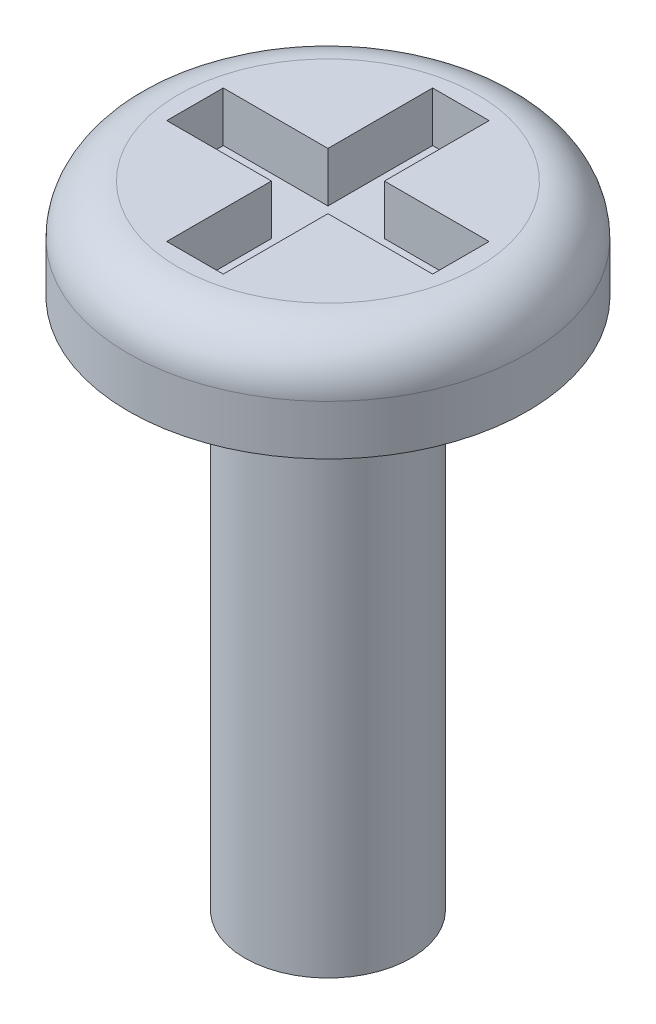
ISO-10303-21;
HEADER;
FILE_DESCRIPTION(('STEP AP214'),'2;1');
FILE_NAME('part.step','',(''),(''),'','','');
FILE_SCHEMA(('AUTOMOTIVE_DESIGN { 1 0 10303 214 1 1 1 1 }'));
ENDSEC;
DATA;
#1=APPLICATION_CONTEXT('core data for automotive mechanical design processes');
#2=APPLICATION_PROTOCOL_DEFINITION('international standard','automotive_design',2000,#1);
#3=PRODUCT_CONTEXT('',#1,'mechanical');
#4=PRODUCT('Part','Part','',(#3));
#5=PRODUCT_RELATED_PRODUCT_CATEGORY('part','',(#4));
#6=PRODUCT_DEFINITION_FORMATION('','',#4);
#7=PRODUCT_DEFINITION_CONTEXT('part definition',#1,'design');
#8=PRODUCT_DEFINITION('design','',#6,#7);
#9=PRODUCT_DEFINITION_SHAPE('','',#8);
#10=(LENGTH_UNIT() NAMED_UNIT(*) SI_UNIT(.MILLI.,.METRE.));
#11=(NAMED_UNIT(*) PLANE_ANGLE_UNIT() SI_UNIT($,.RADIAN.));
#12=(NAMED_UNIT(*) SI_UNIT($,.STERADIAN.) SOLID_ANGLE_UNIT());
#13=UNCERTAINTY_MEASURE_WITH_UNIT(LENGTH_MEASURE(1.E-05),#10,'distance_accuracy_value','');
#14=(GEOMETRIC_REPRESENTATION_CONTEXT(3) GLOBAL_UNCERTAINTY_ASSIGNED_CONTEXT((#13)) GLOBAL_UNIT_ASSIGNED_CONTEXT((#10,
#11,#12)) REPRESENTATION_CONTEXT('',''));
#15=CARTESIAN_POINT('',(0.,0.,0.));
#16=DIRECTION('',(0.,0.,1.));
#17=DIRECTION('',(1.,0.,0.));
#18=AXIS2_PLACEMENT_3D('',#15,#16,#17);
#19=CARTESIAN_POINT('',(0.,8.,0.));
#20=DIRECTION('',(0.,-1.,0.));
#21=DIRECTION('',(0.,0.,-1.));
#22=AXIS2_PLACEMENT_3D('',#19,#20,#21);
#23=CYLINDRICAL_SURFACE('',#22,1.25);
#24=CARTESIAN_POINT('',(0.,0.,0.));
#25=DIRECTION('',(0.,1.,0.));
#26=DIRECTION('',(0.,0.,1.));
#27=AXIS2_PLACEMENT_3D('',#24,#25,#26);
#28=CIRCLE('',#27,1.25);
#29=CARTESIAN_POINT('',(0.,0.,1.25));
#30=VERTEX_POINT('',#29);
#31=EDGE_CURVE('E213',#30,#30,#28,.T.);
#32=ORIENTED_EDGE('',*,*,#31,.T.);
#33=EDGE_LOOP('',(#32));
#34=FACE_BOUND('',#33,.T.);
#35=CARTESIAN_POINT('',(0.,7.,0.));
#36=DIRECTION('',(0.,1.,0.));
#37=DIRECTION('',(0.,0.,1.));
#38=AXIS2_PLACEMENT_3D('',#35,#36,#37);
#39=CIRCLE('',#38,1.25);
#40=CARTESIAN_POINT('',(0.,7.,1.25));
#41=VERTEX_POINT('',#40);
#42=EDGE_CURVE('E11',#41,#41,#39,.T.);
#43=ORIENTED_EDGE('',*,*,#42,.F.);
#44=EDGE_LOOP('',(#43));
#45=FACE_BOUND('',#44,.T.);
#46=ADVANCED_FACE('F36',(#34,#45),#23,.T.);
#47=ORIENTED_EDGE('',*,*,#42,.T.);
#48=EDGE_LOOP('',(#47));
#49=FACE_BOUND('',#48,.T.);
#50=CARTESIAN_POINT('',(0.,8.,0.));
#51=DIRECTION('',(0.,1.,0.));
#52=DIRECTION('',(0.,0.,1.));
#53=AXIS2_PLACEMENT_3D('',#50,#51,#52);
#54=CIRCLE('',#53,1.25);
#55=CARTESIAN_POINT('',(0.,8.,1.25));
#56=VERTEX_POINT('',#55);
#57=EDGE_CURVE('E214',#56,#56,#54,.T.);
#58=ORIENTED_EDGE('',*,*,#57,.F.);
#59=EDGE_LOOP('',(#58));
#60=FACE_BOUND('',#59,.T.);
#61=ADVANCED_FACE('F247',(#49,#60),#23,.T.);
#62=CARTESIAN_POINT('',(0.,0.,0.));
#63=DIRECTION('',(0.,1.,0.));
#64=DIRECTION('',(0.,0.,1.));
#65=AXIS2_PLACEMENT_3D('',#62,#63,#64);
#66=PLANE('',#65);
#67=ORIENTED_EDGE('',*,*,#31,.F.);
#68=EDGE_LOOP('',(#67));
#69=FACE_BOUND('',#68,.T.);
#70=ADVANCED_FACE('F243',(#69),#66,.F.);
#71=CARTESIAN_POINT('',(0.,9.5,0.));
#72=DIRECTION('',(0.,-1.,0.));
#73=DIRECTION('',(0.,0.,-1.));
#74=AXIS2_PLACEMENT_3D('',#71,#72,#73);
#75=CYLINDRICAL_SURFACE('',#74,3.);
#76=CARTESIAN_POINT('',(0.,8.75,0.));
#77=DIRECTION('',(0.,1.,0.));
#78=DIRECTION('',(0.,0.,1.));
#79=AXIS2_PLACEMENT_3D('',#76,#77,#78);
#80=CIRCLE('',#79,3.);
#81=CARTESIAN_POINT('',(0.,8.75,3.));
#82=VERTEX_POINT('',#81);
#83=EDGE_CURVE('E45',#82,#82,#80,.F.);
#84=ORIENTED_EDGE('',*,*,#83,.T.);
#85=EDGE_LOOP('',(#84));
#86=FACE_BOUND('',#85,.T.);
#87=CARTESIAN_POINT('',(0.,8.,0.));
#88=DIRECTION('',(0.,1.,0.));
#89=DIRECTION('',(0.,0.,1.));
#90=AXIS2_PLACEMENT_3D('',#87,#88,#89);
#91=CIRCLE('',#90,3.);
#92=CARTESIAN_POINT('',(0.,8.,3.));
#93=VERTEX_POINT('',#92);
#94=EDGE_CURVE('E193',#93,#93,#91,.T.);
#95=ORIENTED_EDGE('',*,*,#94,.T.);
#96=EDGE_LOOP('',(#95));
#97=FACE_BOUND('',#96,.T.);
#98=ADVANCED_FACE('F224',(#86,#97),#75,.T.);
#99=CARTESIAN_POINT('',(0.,9.5,0.));
#100=DIRECTION('',(0.,1.,0.));
#101=DIRECTION('',(0.,0.,1.));
#102=AXIS2_PLACEMENT_3D('',#99,#100,#101);
#103=PLANE('',#102);
#104=DIRECTION('',(1.,0.,0.));
#105=VECTOR('',#104,1.);
#106=CARTESIAN_POINT('',(0.425,9.5,0.425));
#107=LINE('',#106,#105);
#108=CARTESIAN_POINT('',(0.425,9.5,0.425));
#109=VERTEX_POINT('',#108);
#110=CARTESIAN_POINT('',(2.,9.5,0.425));
#111=VERTEX_POINT('',#110);
#112=EDGE_CURVE('E52',#109,#111,#107,.T.);
#113=ORIENTED_EDGE('',*,*,#112,.F.);
#114=DIRECTION('',(0.,0.,-1.));
#115=VECTOR('',#114,1.);
#116=CARTESIAN_POINT('',(0.425,9.5,0.425));
#117=LINE('',#116,#115);
#118=CARTESIAN_POINT('',(0.425,9.5,2.));
#119=VERTEX_POINT('',#118);
#120=EDGE_CURVE('E189',#119,#109,#117,.T.);
#121=ORIENTED_EDGE('',*,*,#120,.F.);
#122=DIRECTION('',(1.,0.,0.));
#123=VECTOR('',#122,1.);
#124=CARTESIAN_POINT('',(-0.425,9.5,2.));
#125=LINE('',#124,#123);
#126=CARTESIAN_POINT('',(-0.425,9.5,2.));
#127=VERTEX_POINT('',#126);
#128=EDGE_CURVE('E187',#127,#119,#125,.T.);
#129=ORIENTED_EDGE('',*,*,#128,.F.);
#130=DIRECTION('',(0.,0.,1.));
#131=VECTOR('',#130,1.);
#132=CARTESIAN_POINT('',(-0.425,9.5,0.425));
#133=LINE('',#132,#131);
#134=CARTESIAN_POINT('',(-0.425,9.5,0.425));
#135=VERTEX_POINT('',#134);
#136=EDGE_CURVE('E136',#135,#127,#133,.T.);
#137=ORIENTED_EDGE('',*,*,#136,.F.);
#138=DIRECTION('',(1.,0.,0.));
#139=VECTOR('',#138,1.);
#140=CARTESIAN_POINT('',(-2.,9.5,0.425));
#141=LINE('',#140,#139);
#142=CARTESIAN_POINT('',(-2.,9.5,0.425));
#143=VERTEX_POINT('',#142);
#144=EDGE_CURVE('E183',#143,#135,#141,.T.);
#145=ORIENTED_EDGE('',*,*,#144,.F.);
#146=DIRECTION('',(0.,0.,1.));
#147=VECTOR('',#146,1.);
#148=CARTESIAN_POINT('',(-2.,9.5,-0.425));
#149=LINE('',#148,#147);
#150=CARTESIAN_POINT('',(-2.,9.5,-0.425));
#151=VERTEX_POINT('',#150);
#152=EDGE_CURVE('E180',#151,#143,#149,.T.);
#153=ORIENTED_EDGE('',*,*,#152,.F.);
#154=DIRECTION('',(-1.,0.,0.));
#155=VECTOR('',#154,1.);
#156=CARTESIAN_POINT('',(-2.,9.5,-0.425));
#157=LINE('',#156,#155);
#158=CARTESIAN_POINT('',(-0.425,9.5,-0.425));
#159=VERTEX_POINT('',#158);
#160=EDGE_CURVE('E177',#159,#151,#157,.T.);
#161=ORIENTED_EDGE('',*,*,#160,.F.);
#162=DIRECTION('',(0.,0.,1.));
#163=VECTOR('',#162,1.);
#164=CARTESIAN_POINT('',(-0.425,9.5,-2.));
#165=LINE('',#164,#163);
#166=CARTESIAN_POINT('',(-0.425,9.5,-2.));
#167=VERTEX_POINT('',#166);
#168=EDGE_CURVE('E174',#167,#159,#165,.T.);
#169=ORIENTED_EDGE('',*,*,#168,.F.);
#170=DIRECTION('',(-1.,0.,0.));
#171=VECTOR('',#170,1.);
#172=CARTESIAN_POINT('',(-0.425,9.5,-2.));
#173=LINE('',#172,#171);
#174=CARTESIAN_POINT('',(0.425,9.5,-2.));
#175=VERTEX_POINT('',#174);
#176=EDGE_CURVE('E171',#175,#167,#173,.T.);
#177=ORIENTED_EDGE('',*,*,#176,.F.);
#178=DIRECTION('',(0.,0.,-1.));
#179=VECTOR('',#178,1.);
#180=CARTESIAN_POINT('',(0.425,9.5,-2.));
#181=LINE('',#180,#179);
#182=CARTESIAN_POINT('',(0.425,9.5,-0.425));
#183=VERTEX_POINT('',#182);
#184=EDGE_CURVE('E168',#183,#175,#181,.T.);
#185=ORIENTED_EDGE('',*,*,#184,.F.);
#186=DIRECTION('',(-1.,0.,0.));
#187=VECTOR('',#186,1.);
#188=CARTESIAN_POINT('',(0.425,9.5,-0.425));
#189=LINE('',#188,#187);
#190=CARTESIAN_POINT('',(2.,9.5,-0.425));
#191=VERTEX_POINT('',#190);
#192=EDGE_CURVE('E165',#191,#183,#189,.T.);
#193=ORIENTED_EDGE('',*,*,#192,.F.);
#194=DIRECTION('',(0.,0.,-1.));
#195=VECTOR('',#194,1.);
#196=CARTESIAN_POINT('',(2.,9.5,-0.425));
#197=LINE('',#196,#195);
#198=EDGE_CURVE('E162',#111,#191,#197,.T.);
#199=ORIENTED_EDGE('',*,*,#198,.F.);
#200=EDGE_LOOP('',(#113,#121,#129,#137,#145,#153,#161,#169,#177,#185,#193,#199));
#201=FACE_BOUND('',#200,.T.);
#202=CARTESIAN_POINT('',(0.,9.5,0.));
#203=DIRECTION('',(0.,1.,0.));
#204=DIRECTION('',(0.,0.,1.));
#205=AXIS2_PLACEMENT_3D('',#202,#203,#204);
#206=CIRCLE('',#205,2.25);
#207=CARTESIAN_POINT('',(0.,9.5,2.25));
#208=VERTEX_POINT('',#207);
#209=EDGE_CURVE('E217',#208,#208,#206,.T.);
#210=ORIENTED_EDGE('',*,*,#209,.T.);
#211=EDGE_LOOP('',(#210));
#212=FACE_BOUND('',#211,.T.);
#213=ADVANCED_FACE('F233',(#201,#212),#103,.T.);
#214=CARTESIAN_POINT('',(0.,8.,0.));
#215=DIRECTION('',(0.,1.,0.));
#216=DIRECTION('',(0.,0.,1.));
#217=AXIS2_PLACEMENT_3D('',#214,#215,#216);
#218=PLANE('',#217);
#219=ORIENTED_EDGE('',*,*,#57,.T.);
#220=EDGE_LOOP('',(#219));
#221=FACE_BOUND('',#220,.T.);
#222=ORIENTED_EDGE('',*,*,#94,.F.);
#223=EDGE_LOOP('',(#222));
#224=FACE_BOUND('',#223,.T.);
#225=ADVANCED_FACE('F230',(#221,#224),#218,.F.);
#226=CARTESIAN_POINT('',(0.,8.75,0.));
#227=DIRECTION('',(0.,1.,0.));
#228=DIRECTION('',(0.,0.,1.));
#229=AXIS2_PLACEMENT_3D('',#226,#227,#228);
#230=TOROIDAL_SURFACE('',#229,2.25,0.75);
#231=ORIENTED_EDGE('',*,*,#83,.F.);
#232=EDGE_LOOP('',(#231));
#233=FACE_BOUND('',#232,.T.);
#234=ORIENTED_EDGE('',*,*,#209,.F.);
#235=EDGE_LOOP('',(#234));
#236=FACE_BOUND('',#235,.T.);
#237=ADVANCED_FACE('F38',(#233,#236),#230,.T.);
#238=CARTESIAN_POINT('',(0.425,8.75,0.425));
#239=DIRECTION('',(0.,0.,1.));
#240=DIRECTION('',(1.,0.,0.));
#241=AXIS2_PLACEMENT_3D('',#238,#239,#240);
#242=PLANE('',#241);
#243=ORIENTED_EDGE('',*,*,#112,.T.);
#244=DIRECTION('',(0.,1.,0.));
#245=VECTOR('',#244,1.);
#246=CARTESIAN_POINT('',(2.,8.75,0.425));
#247=LINE('',#246,#245);
#248=CARTESIAN_POINT('',(2.,8.75,0.425));
#249=VERTEX_POINT('',#248);
#250=EDGE_CURVE('E100',#249,#111,#247,.T.);
#251=ORIENTED_EDGE('',*,*,#250,.F.);
#252=DIRECTION('',(1.,0.,0.));
#253=VECTOR('',#252,1.);
#254=CARTESIAN_POINT('',(0.425,8.75,0.425));
#255=LINE('',#254,#253);
#256=CARTESIAN_POINT('',(0.425,8.75,0.425));
#257=VERTEX_POINT('',#256);
#258=EDGE_CURVE('E191',#257,#249,#255,.T.);
#259=ORIENTED_EDGE('',*,*,#258,.F.);
#260=DIRECTION('',(0.,1.,0.));
#261=VECTOR('',#260,1.);
#262=CARTESIAN_POINT('',(0.425,8.75,0.425));
#263=LINE('',#262,#261);
#264=EDGE_CURVE('E60',#257,#109,#263,.T.);
#265=ORIENTED_EDGE('',*,*,#264,.T.);
#266=EDGE_LOOP('',(#243,#251,#259,#265));
#267=FACE_BOUND('',#266,.T.);
#268=ADVANCED_FACE('F229',(#267),#242,.F.);
#269=CARTESIAN_POINT('',(0.425,8.75,0.425));
#270=DIRECTION('',(1.,0.,0.));
#271=DIRECTION('',(0.,0.,-1.));
#272=AXIS2_PLACEMENT_3D('',#269,#270,#271);
#273=PLANE('',#272);
#274=ORIENTED_EDGE('',*,*,#120,.T.);
#275=ORIENTED_EDGE('',*,*,#264,.F.);
#276=DIRECTION('',(0.,0.,-1.));
#277=VECTOR('',#276,1.);
#278=CARTESIAN_POINT('',(0.425,8.75,0.425));
#279=LINE('',#278,#277);
#280=CARTESIAN_POINT('',(0.425,8.75,2.));
#281=VERTEX_POINT('',#280);
#282=EDGE_CURVE('E148',#281,#257,#279,.T.);
#283=ORIENTED_EDGE('',*,*,#282,.F.);
#284=DIRECTION('',(0.,1.,0.));
#285=VECTOR('',#284,1.);
#286=CARTESIAN_POINT('',(0.425,8.75,2.));
#287=LINE('',#286,#285);
#288=EDGE_CURVE('E140',#281,#119,#287,.T.);
#289=ORIENTED_EDGE('',*,*,#288,.T.);
#290=EDGE_LOOP('',(#274,#275,#283,#289));
#291=FACE_BOUND('',#290,.T.);
#292=ADVANCED_FACE('F288',(#291),#273,.F.);
#293=CARTESIAN_POINT('',(-0.425,8.75,2.));
#294=DIRECTION('',(0.,0.,1.));
#295=DIRECTION('',(1.,0.,0.));
#296=AXIS2_PLACEMENT_3D('',#293,#294,#295);
#297=PLANE('',#296);
#298=ORIENTED_EDGE('',*,*,#128,.T.);
#299=ORIENTED_EDGE('',*,*,#288,.F.);
#300=DIRECTION('',(1.,0.,0.));
#301=VECTOR('',#300,1.);
#302=CARTESIAN_POINT('',(-0.425,8.75,2.));
#303=LINE('',#302,#301);
#304=CARTESIAN_POINT('',(-0.425,8.75,2.));
#305=VERTEX_POINT('',#304);
#306=EDGE_CURVE('E144',#305,#281,#303,.T.);
#307=ORIENTED_EDGE('',*,*,#306,.F.);
#308=DIRECTION('',(0.,1.,0.));
#309=VECTOR('',#308,1.);
#310=CARTESIAN_POINT('',(-0.425,8.75,2.));
#311=LINE('',#310,#309);
#312=EDGE_CURVE('E129',#305,#127,#311,.T.);
#313=ORIENTED_EDGE('',*,*,#312,.T.);
#314=EDGE_LOOP('',(#298,#299,#307,#313));
#315=FACE_BOUND('',#314,.T.);
#316=ADVANCED_FACE('F145',(#315),#297,.F.);
#317=CARTESIAN_POINT('',(-0.425,8.75,0.425));
#318=DIRECTION('',(-1.,0.,0.));
#319=DIRECTION('',(0.,0.,1.));
#320=AXIS2_PLACEMENT_3D('',#317,#318,#319);
#321=PLANE('',#320);
#322=ORIENTED_EDGE('',*,*,#136,.T.);
#323=ORIENTED_EDGE('',*,*,#312,.F.);
#324=DIRECTION('',(0.,0.,1.));
#325=VECTOR('',#324,1.);
#326=CARTESIAN_POINT('',(-0.425,8.75,0.425));
#327=LINE('',#326,#325);
#328=CARTESIAN_POINT('',(-0.425,8.75,0.425));
#329=VERTEX_POINT('',#328);
#330=EDGE_CURVE('E133',#329,#305,#327,.T.);
#331=ORIENTED_EDGE('',*,*,#330,.F.);
#332=DIRECTION('',(0.,1.,0.));
#333=VECTOR('',#332,1.);
#334=CARTESIAN_POINT('',(-0.425,8.75,0.425));
#335=LINE('',#334,#333);
#336=EDGE_CURVE('E141',#329,#135,#335,.T.);
#337=ORIENTED_EDGE('',*,*,#336,.T.);
#338=EDGE_LOOP('',(#322,#323,#331,#337));
#339=FACE_BOUND('',#338,.T.);
#340=ADVANCED_FACE('F131',(#339),#321,.F.);
#341=CARTESIAN_POINT('',(-2.,8.75,0.425));
#342=DIRECTION('',(0.,0.,1.));
#343=DIRECTION('',(1.,0.,0.));
#344=AXIS2_PLACEMENT_3D('',#341,#342,#343);
#345=PLANE('',#344);
#346=ORIENTED_EDGE('',*,*,#144,.T.);
#347=ORIENTED_EDGE('',*,*,#336,.F.);
#348=DIRECTION('',(1.,0.,0.));
#349=VECTOR('',#348,1.);
#350=CARTESIAN_POINT('',(-2.,8.75,0.425));
#351=LINE('',#350,#349);
#352=CARTESIAN_POINT('',(-2.,8.75,0.425));
#353=VERTEX_POINT('',#352);
#354=EDGE_CURVE('E154',#353,#329,#351,.T.);
#355=ORIENTED_EDGE('',*,*,#354,.F.);
#356=DIRECTION('',(0.,1.,0.));
#357=VECTOR('',#356,1.);
#358=CARTESIAN_POINT('',(-2.,8.75,0.425));
#359=LINE('',#358,#357);
#360=EDGE_CURVE('E196',#353,#143,#359,.T.);
#361=ORIENTED_EDGE('',*,*,#360,.T.);
#362=EDGE_LOOP('',(#346,#347,#355,#361));
#363=FACE_BOUND('',#362,.T.);
#364=ADVANCED_FACE('F312',(#363),#345,.F.);
#365=CARTESIAN_POINT('',(-2.,8.75,-0.425));
#366=DIRECTION('',(-1.,0.,0.));
#367=DIRECTION('',(0.,0.,1.));
#368=AXIS2_PLACEMENT_3D('',#365,#366,#367);
#369=PLANE('',#368);
#370=ORIENTED_EDGE('',*,*,#152,.T.);
#371=ORIENTED_EDGE('',*,*,#360,.F.);
#372=DIRECTION('',(0.,0.,1.));
#373=VECTOR('',#372,1.);
#374=CARTESIAN_POINT('',(-2.,8.75,-0.425));
#375=LINE('',#374,#373);
#376=CARTESIAN_POINT('',(-2.,8.75,-0.425));
#377=VERTEX_POINT('',#376);
#378=EDGE_CURVE('E156',#377,#353,#375,.T.);
#379=ORIENTED_EDGE('',*,*,#378,.F.);
#380=DIRECTION('',(0.,1.,0.));
#381=VECTOR('',#380,1.);
#382=CARTESIAN_POINT('',(-2.,8.75,-0.425));
#383=LINE('',#382,#381);
#384=EDGE_CURVE('E198',#377,#151,#383,.T.);
#385=ORIENTED_EDGE('',*,*,#384,.T.);
#386=EDGE_LOOP('',(#370,#371,#379,#385));
#387=FACE_BOUND('',#386,.T.);
#388=ADVANCED_FACE('F321',(#387),#369,.F.);
#389=CARTESIAN_POINT('',(-2.,8.75,-0.425));
#390=DIRECTION('',(0.,0.,-1.));
#391=DIRECTION('',(-1.,0.,0.));
#392=AXIS2_PLACEMENT_3D('',#389,#390,#391);
#393=PLANE('',#392);
#394=ORIENTED_EDGE('',*,*,#160,.T.);
#395=ORIENTED_EDGE('',*,*,#384,.F.);
#396=DIRECTION('',(-1.,0.,0.));
#397=VECTOR('',#396,1.);
#398=CARTESIAN_POINT('',(-2.,8.75,-0.425));
#399=LINE('',#398,#397);
#400=CARTESIAN_POINT('',(-0.425,8.75,-0.425));
#401=VERTEX_POINT('',#400);
#402=EDGE_CURVE('E442',#401,#377,#399,.T.);
#403=ORIENTED_EDGE('',*,*,#402,.F.);
#404=DIRECTION('',(0.,1.,0.));
#405=VECTOR('',#404,1.);
#406=CARTESIAN_POINT('',(-0.425,8.75,-0.425));
#407=LINE('',#406,#405);
#408=EDGE_CURVE('E200',#401,#159,#407,.T.);
#409=ORIENTED_EDGE('',*,*,#408,.T.);
#410=EDGE_LOOP('',(#394,#395,#403,#409));
#411=FACE_BOUND('',#410,.T.);
#412=ADVANCED_FACE('F331',(#411),#393,.F.);
#413=CARTESIAN_POINT('',(-0.425,8.75,-2.));
#414=DIRECTION('',(-1.,0.,0.));
#415=DIRECTION('',(0.,0.,1.));
#416=AXIS2_PLACEMENT_3D('',#413,#414,#415);
#417=PLANE('',#416);
#418=ORIENTED_EDGE('',*,*,#168,.T.);
#419=ORIENTED_EDGE('',*,*,#408,.F.);
#420=DIRECTION('',(0.,0.,1.));
#421=VECTOR('',#420,1.);
#422=CARTESIAN_POINT('',(-0.425,8.75,-2.));
#423=LINE('',#422,#421);
#424=CARTESIAN_POINT('',(-0.425,8.75,-2.));
#425=VERTEX_POINT('',#424);
#426=EDGE_CURVE('E439',#425,#401,#423,.T.);
#427=ORIENTED_EDGE('',*,*,#426,.F.);
#428=DIRECTION('',(0.,1.,0.));
#429=VECTOR('',#428,1.);
#430=CARTESIAN_POINT('',(-0.425,8.75,-2.));
#431=LINE('',#430,#429);
#432=EDGE_CURVE('E202',#425,#167,#431,.T.);
#433=ORIENTED_EDGE('',*,*,#432,.T.);
#434=EDGE_LOOP('',(#418,#419,#427,#433));
#435=FACE_BOUND('',#434,.T.);
#436=ADVANCED_FACE('F341',(#435),#417,.F.);
#437=CARTESIAN_POINT('',(-0.425,8.75,-2.));
#438=DIRECTION('',(0.,0.,-1.));
#439=DIRECTION('',(-1.,0.,0.));
#440=AXIS2_PLACEMENT_3D('',#437,#438,#439);
#441=PLANE('',#440);
#442=ORIENTED_EDGE('',*,*,#176,.T.);
#443=ORIENTED_EDGE('',*,*,#432,.F.);
#444=DIRECTION('',(-1.,0.,0.));
#445=VECTOR('',#444,1.);
#446=CARTESIAN_POINT('',(-0.425,8.75,-2.));
#447=LINE('',#446,#445);
#448=CARTESIAN_POINT('',(0.425,8.75,-2.));
#449=VERTEX_POINT('',#448);
#450=EDGE_CURVE('E436',#449,#425,#447,.T.);
#451=ORIENTED_EDGE('',*,*,#450,.F.);
#452=DIRECTION('',(0.,1.,0.));
#453=VECTOR('',#452,1.);
#454=CARTESIAN_POINT('',(0.425,8.75,-2.));
#455=LINE('',#454,#453);
#456=EDGE_CURVE('E204',#449,#175,#455,.T.);
#457=ORIENTED_EDGE('',*,*,#456,.T.);
#458=EDGE_LOOP('',(#442,#443,#451,#457));
#459=FACE_BOUND('',#458,.T.);
#460=ADVANCED_FACE('F351',(#459),#441,.F.);
#461=CARTESIAN_POINT('',(0.425,8.75,-2.));
#462=DIRECTION('',(1.,0.,0.));
#463=DIRECTION('',(0.,0.,-1.));
#464=AXIS2_PLACEMENT_3D('',#461,#462,#463);
#465=PLANE('',#464);
#466=ORIENTED_EDGE('',*,*,#184,.T.);
#467=ORIENTED_EDGE('',*,*,#456,.F.);
#468=DIRECTION('',(0.,0.,-1.));
#469=VECTOR('',#468,1.);
#470=CARTESIAN_POINT('',(0.425,8.75,-2.));
#471=LINE('',#470,#469);
#472=CARTESIAN_POINT('',(0.425,8.75,-0.425));
#473=VERTEX_POINT('',#472);
#474=EDGE_CURVE('E429',#473,#449,#471,.T.);
#475=ORIENTED_EDGE('',*,*,#474,.F.);
#476=DIRECTION('',(0.,1.,0.));
#477=VECTOR('',#476,1.);
#478=CARTESIAN_POINT('',(0.425,8.75,-0.425));
#479=LINE('',#478,#477);
#480=EDGE_CURVE('E206',#473,#183,#479,.T.);
#481=ORIENTED_EDGE('',*,*,#480,.T.);
#482=EDGE_LOOP('',(#466,#467,#475,#481));
#483=FACE_BOUND('',#482,.T.);
#484=ADVANCED_FACE('F361',(#483),#465,.F.);
#485=CARTESIAN_POINT('',(0.425,8.75,-0.425));
#486=DIRECTION('',(0.,0.,-1.));
#487=DIRECTION('',(-1.,0.,0.));
#488=AXIS2_PLACEMENT_3D('',#485,#486,#487);
#489=PLANE('',#488);
#490=ORIENTED_EDGE('',*,*,#192,.T.);
#491=ORIENTED_EDGE('',*,*,#480,.F.);
#492=DIRECTION('',(-1.,0.,0.));
#493=VECTOR('',#492,1.);
#494=CARTESIAN_POINT('',(0.425,8.75,-0.425));
#495=LINE('',#494,#493);
#496=CARTESIAN_POINT('',(2.,8.75,-0.425));
#497=VERTEX_POINT('',#496);
#498=EDGE_CURVE('E426',#497,#473,#495,.T.);
#499=ORIENTED_EDGE('',*,*,#498,.F.);
#500=DIRECTION('',(0.,1.,0.));
#501=VECTOR('',#500,1.);
#502=CARTESIAN_POINT('',(2.,8.75,-0.425));
#503=LINE('',#502,#501);
#504=EDGE_CURVE('E208',#497,#191,#503,.T.);
#505=ORIENTED_EDGE('',*,*,#504,.T.);
#506=EDGE_LOOP('',(#490,#491,#499,#505));
#507=FACE_BOUND('',#506,.T.);
#508=ADVANCED_FACE('F371',(#507),#489,.F.);
#509=CARTESIAN_POINT('',(2.,8.75,-0.425));
#510=DIRECTION('',(1.,0.,0.));
#511=DIRECTION('',(0.,0.,-1.));
#512=AXIS2_PLACEMENT_3D('',#509,#510,#511);
#513=PLANE('',#512);
#514=ORIENTED_EDGE('',*,*,#198,.T.);
#515=ORIENTED_EDGE('',*,*,#504,.F.);
#516=DIRECTION('',(0.,0.,-1.));
#517=VECTOR('',#516,1.);
#518=CARTESIAN_POINT('',(2.,8.75,-0.425));
#519=LINE('',#518,#517);
#520=EDGE_CURVE('E430',#249,#497,#519,.T.);
#521=ORIENTED_EDGE('',*,*,#520,.F.);
#522=ORIENTED_EDGE('',*,*,#250,.T.);
#523=EDGE_LOOP('',(#514,#515,#521,#522));
#524=FACE_BOUND('',#523,.T.);
#525=ADVANCED_FACE('F381',(#524),#513,.F.);
#526=CARTESIAN_POINT('',(0.,8.75,0.));
#527=DIRECTION('',(0.,-1.,0.));
#528=DIRECTION('',(0.,0.,-1.));
#529=AXIS2_PLACEMENT_3D('',#526,#527,#528);
#530=PLANE('',#529);
#531=ORIENTED_EDGE('',*,*,#258,.T.);
#532=ORIENTED_EDGE('',*,*,#520,.T.);
#533=ORIENTED_EDGE('',*,*,#498,.T.);
#534=ORIENTED_EDGE('',*,*,#474,.T.);
#535=ORIENTED_EDGE('',*,*,#450,.T.);
#536=ORIENTED_EDGE('',*,*,#426,.T.);
#537=ORIENTED_EDGE('',*,*,#402,.T.);
#538=ORIENTED_EDGE('',*,*,#378,.T.);
#539=ORIENTED_EDGE('',*,*,#354,.T.);
#540=ORIENTED_EDGE('',*,*,#330,.T.);
#541=ORIENTED_EDGE('',*,*,#306,.T.);
#542=ORIENTED_EDGE('',*,*,#282,.T.);
#543=EDGE_LOOP('',(#531,#532,#533,#534,#535,#536,#537,#538,#539,#540,#541,#542));
#544=FACE_BOUND('',#543,.T.);
#545=ADVANCED_FACE('F151',(#544),#530,.F.);
#546=CLOSED_SHELL('',(#46,#61,#70,#98,#213,#225,#237,#268,#292,#316,#340,#364,#388,#412,#436,
#460,#484,#508,#525,#545));
#547=MANIFOLD_SOLID_BREP('B2',#546);
#548=ADVANCED_BREP_SHAPE_REPRESENTATION('',(#18,#547),#14);
#549=SHAPE_DEFINITION_REPRESENTATION(#9,#548);
ENDSEC;
END-ISO-10303-21;
